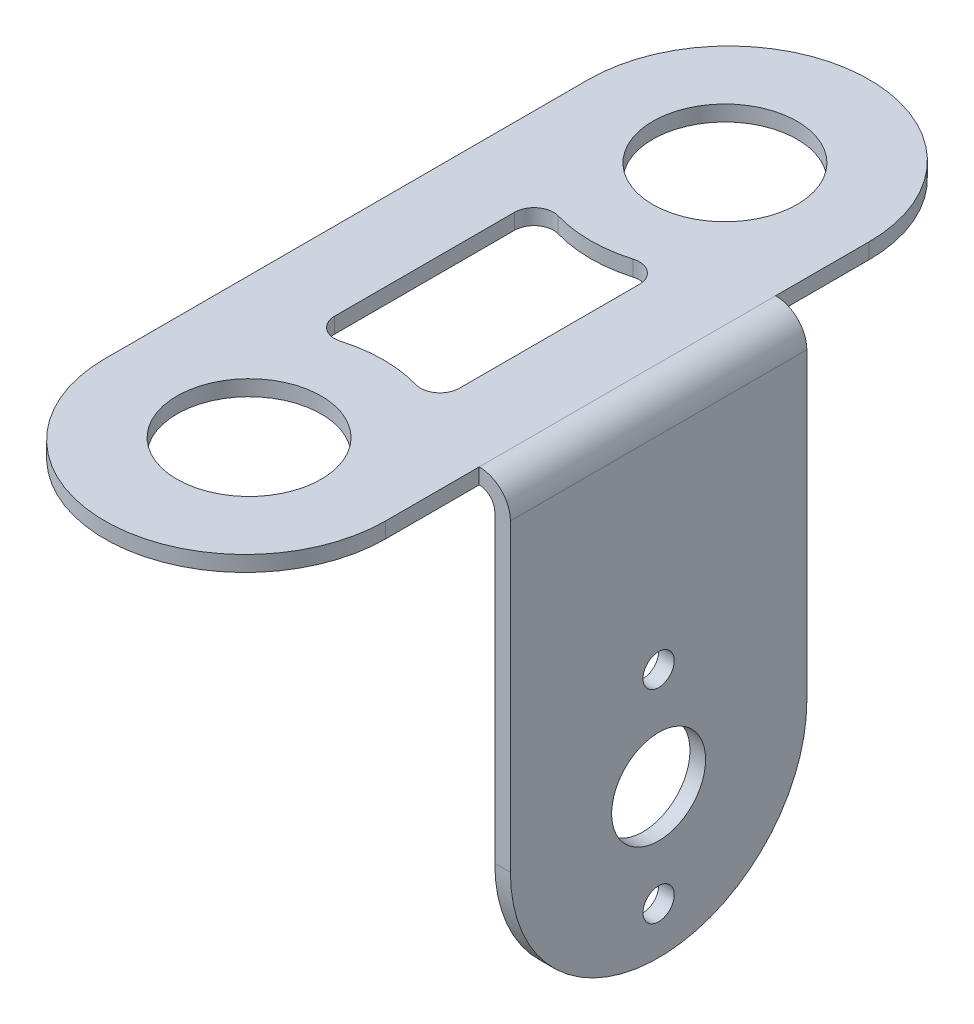
ISO-10303-21;
HEADER;
FILE_DESCRIPTION(('STEP AP214'),'2;1');
FILE_NAME('part.step','',(''),(''),'','','');
FILE_SCHEMA(('AUTOMOTIVE_DESIGN { 1 0 10303 214 1 1 1 1 }'));
ENDSEC;
DATA;
#1=APPLICATION_CONTEXT('core data for automotive mechanical design processes');
#2=APPLICATION_PROTOCOL_DEFINITION('international standard','automotive_design',2000,#1);
#3=PRODUCT_CONTEXT('',#1,'mechanical');
#4=PRODUCT('Part','Part','',(#3));
#5=PRODUCT_RELATED_PRODUCT_CATEGORY('part','',(#4));
#6=PRODUCT_DEFINITION_FORMATION('','',#4);
#7=PRODUCT_DEFINITION_CONTEXT('part definition',#1,'design');
#8=PRODUCT_DEFINITION('design','',#6,#7);
#9=PRODUCT_DEFINITION_SHAPE('','',#8);
#10=(LENGTH_UNIT() NAMED_UNIT(*) SI_UNIT(.MILLI.,.METRE.));
#11=(NAMED_UNIT(*) PLANE_ANGLE_UNIT() SI_UNIT($,.RADIAN.));
#12=(NAMED_UNIT(*) SI_UNIT($,.STERADIAN.) SOLID_ANGLE_UNIT());
#13=UNCERTAINTY_MEASURE_WITH_UNIT(LENGTH_MEASURE(1.E-05),#10,'distance_accuracy_value','');
#14=(GEOMETRIC_REPRESENTATION_CONTEXT(3) GLOBAL_UNCERTAINTY_ASSIGNED_CONTEXT((#13)) GLOBAL_UNIT_ASSIGNED_CONTEXT((#10,
#11,#12)) REPRESENTATION_CONTEXT('',''));
#15=CARTESIAN_POINT('',(0.,0.,0.));
#16=DIRECTION('',(0.,0.,1.));
#17=DIRECTION('',(1.,0.,0.));
#18=AXIS2_PLACEMENT_3D('',#15,#16,#17);
#19=CARTESIAN_POINT('',(-38.,60.,-31.));
#20=DIRECTION('',(-1.,0.,0.));
#21=DIRECTION('',(0.,0.,1.));
#22=AXIS2_PLACEMENT_3D('',#19,#20,#21);
#23=PLANE('',#22);
#24=DIRECTION('',(0.,0.,-1.));
#25=VECTOR('',#24,1.);
#26=CARTESIAN_POINT('',(-38.,62.,0.));
#27=LINE('',#26,#25);
#28=CARTESIAN_POINT('',(-38.,62.,31.));
#29=VERTEX_POINT('',#28);
#30=CARTESIAN_POINT('',(-38.,62.,-31.0000000036919));
#31=VERTEX_POINT('',#30);
#32=EDGE_CURVE('E187',#29,#31,#27,.T.);
#33=ORIENTED_EDGE('',*,*,#32,.T.);
#34=DIRECTION('',(0.,1.,0.));
#35=VECTOR('',#34,1.);
#36=CARTESIAN_POINT('',(-38.,61.,-31.0000000073837));
#37=LINE('',#36,#35);
#38=CARTESIAN_POINT('',(-38.,60.,-31.0000000036919));
#39=VERTEX_POINT('',#38);
#40=EDGE_CURVE('E211',#31,#39,#37,.F.);
#41=ORIENTED_EDGE('',*,*,#40,.T.);
#42=DIRECTION('',(0.,0.,-1.));
#43=VECTOR('',#42,1.);
#44=CARTESIAN_POINT('',(-38.,60.,0.));
#45=LINE('',#44,#43);
#46=CARTESIAN_POINT('',(-38.,60.,31.));
#47=VERTEX_POINT('',#46);
#48=EDGE_CURVE('E158',#47,#39,#45,.T.);
#49=ORIENTED_EDGE('',*,*,#48,.F.);
#50=DIRECTION('',(0.,-1.,0.));
#51=VECTOR('',#50,1.);
#52=CARTESIAN_POINT('',(-38.,61.,31.));
#53=LINE('',#52,#51);
#54=EDGE_CURVE('E155',#47,#29,#53,.F.);
#55=ORIENTED_EDGE('',*,*,#54,.T.);
#56=EDGE_LOOP('',(#33,#41,#49,#55));
#57=FACE_BOUND('',#56,.T.);
#58=ADVANCED_FACE('F16',(#57),#23,.T.);
#59=CARTESIAN_POINT('',(-25.5,60.,11.531275741));
#60=DIRECTION('',(0.,1.,0.));
#61=DIRECTION('',(0.,0.,1.));
#62=AXIS2_PLACEMENT_3D('',#59,#60,#61);
#63=CYLINDRICAL_SURFACE('',#62,2.5);
#64=CARTESIAN_POINT('',(-25.5,62.,11.531275741));
#65=DIRECTION('',(0.,1.,0.));
#66=DIRECTION('',(0.,0.,1.));
#67=AXIS2_PLACEMENT_3D('',#64,#65,#66);
#68=CIRCLE('',#67,2.5);
#69=CARTESIAN_POINT('',(-27.999999996,62.,11.531275741));
#70=VERTEX_POINT('',#69);
#71=CARTESIAN_POINT('',(-24.8037974650547,62.,13.9323800769473));
#72=VERTEX_POINT('',#71);
#73=EDGE_CURVE('E190',#70,#72,#68,.T.);
#74=ORIENTED_EDGE('',*,*,#73,.T.);
#75=DIRECTION('',(0.,1.,0.));
#76=VECTOR('',#75,1.);
#77=CARTESIAN_POINT('',(-24.8037974618409,61.,13.9323800760154));
#78=LINE('',#77,#76);
#79=CARTESIAN_POINT('',(-24.8037974651039,60.,13.9323800767773));
#80=VERTEX_POINT('',#79);
#81=EDGE_CURVE('E222',#72,#80,#78,.F.);
#82=ORIENTED_EDGE('',*,*,#81,.T.);
#83=CARTESIAN_POINT('',(-25.5,60.,11.531275741));
#84=DIRECTION('',(0.,1.,0.));
#85=DIRECTION('',(0.,0.,1.));
#86=AXIS2_PLACEMENT_3D('',#83,#84,#85);
#87=CIRCLE('',#86,2.5);
#88=CARTESIAN_POINT('',(-27.999999996,60.,11.531275741));
#89=VERTEX_POINT('',#88);
#90=EDGE_CURVE('E199',#89,#80,#87,.T.);
#91=ORIENTED_EDGE('',*,*,#90,.F.);
#92=DIRECTION('',(0.,1.,0.));
#93=VECTOR('',#92,1.);
#94=CARTESIAN_POINT('',(-28.,61.,11.531275741));
#95=LINE('',#94,#93);
#96=EDGE_CURVE('E207',#89,#70,#95,.T.);
#97=ORIENTED_EDGE('',*,*,#96,.T.);
#98=EDGE_LOOP('',(#74,#82,#91,#97));
#99=FACE_BOUND('',#98,.T.);
#100=ADVANCED_FACE('F413',(#99),#63,.F.);
#101=CARTESIAN_POINT('',(-20.,60.,30.5));
#102=DIRECTION('',(0.,1.,0.));
#103=DIRECTION('',(0.,0.,1.));
#104=AXIS2_PLACEMENT_3D('',#101,#102,#103);
#105=CYLINDRICAL_SURFACE('',#104,17.25);
#106=DIRECTION('',(0.,-1.,0.));
#107=VECTOR('',#106,1.);
#108=CARTESIAN_POINT('',(-15.1962025311328,61.,13.9323800776843));
#109=LINE('',#108,#107);
#110=CARTESIAN_POINT('',(-15.1962025314322,60.,13.9323800777817));
#111=VERTEX_POINT('',#110);
#112=CARTESIAN_POINT('',(-15.1962025313829,62.,13.9323800776118));
#113=VERTEX_POINT('',#112);
#114=EDGE_CURVE('E220',#111,#113,#109,.F.);
#115=ORIENTED_EDGE('',*,*,#114,.F.);
#116=CARTESIAN_POINT('',(-20.,60.,30.5));
#117=DIRECTION('',(0.,1.,0.));
#118=DIRECTION('',(0.,0.,1.));
#119=AXIS2_PLACEMENT_3D('',#116,#117,#118);
#120=CIRCLE('',#119,17.25);
#121=EDGE_CURVE('E298',#80,#111,#120,.F.);
#122=ORIENTED_EDGE('',*,*,#121,.F.);
#123=ORIENTED_EDGE('',*,*,#81,.F.);
#124=CARTESIAN_POINT('',(-20.,62.,30.5));
#125=DIRECTION('',(0.,1.,0.));
#126=DIRECTION('',(0.,0.,1.));
#127=AXIS2_PLACEMENT_3D('',#124,#125,#126);
#128=CIRCLE('',#127,17.25);
#129=EDGE_CURVE('E280',#72,#113,#128,.F.);
#130=ORIENTED_EDGE('',*,*,#129,.T.);
#131=EDGE_LOOP('',(#115,#122,#123,#130));
#132=FACE_BOUND('',#131,.T.);
#133=ADVANCED_FACE('F417',(#132),#105,.T.);
#134=CARTESIAN_POINT('',(-14.5,60.,11.531275741));
#135=DIRECTION('',(0.,1.,0.));
#136=DIRECTION('',(0.,0.,1.));
#137=AXIS2_PLACEMENT_3D('',#134,#135,#136);
#138=CYLINDRICAL_SURFACE('',#137,2.5);
#139=CARTESIAN_POINT('',(-14.5,62.,11.531275741));
#140=DIRECTION('',(0.,1.,0.));
#141=DIRECTION('',(0.,0.,1.));
#142=AXIS2_PLACEMENT_3D('',#139,#140,#141);
#143=CIRCLE('',#142,2.5);
#144=CARTESIAN_POINT('',(-12.000000004,62.,11.531275741));
#145=VERTEX_POINT('',#144);
#146=EDGE_CURVE('E186',#113,#145,#143,.T.);
#147=ORIENTED_EDGE('',*,*,#146,.T.);
#148=DIRECTION('',(0.,-1.,0.));
#149=VECTOR('',#148,1.);
#150=CARTESIAN_POINT('',(-12.,61.,11.531275741));
#151=LINE('',#150,#149);
#152=CARTESIAN_POINT('',(-12.000000004,60.,11.531275741));
#153=VERTEX_POINT('',#152);
#154=EDGE_CURVE('E217',#145,#153,#151,.T.);
#155=ORIENTED_EDGE('',*,*,#154,.T.);
#156=CARTESIAN_POINT('',(-14.5,60.,11.531275741));
#157=DIRECTION('',(0.,1.,0.));
#158=DIRECTION('',(0.,0.,1.));
#159=AXIS2_PLACEMENT_3D('',#156,#157,#158);
#160=CIRCLE('',#159,2.5);
#161=EDGE_CURVE('E195',#111,#153,#160,.T.);
#162=ORIENTED_EDGE('',*,*,#161,.F.);
#163=ORIENTED_EDGE('',*,*,#114,.T.);
#164=EDGE_LOOP('',(#147,#155,#162,#163));
#165=FACE_BOUND('',#164,.T.);
#166=ADVANCED_FACE('F409',(#165),#138,.F.);
#167=CARTESIAN_POINT('',(-12.,60.,-11.531275741));
#168=DIRECTION('',(1.,0.,0.));
#169=DIRECTION('',(0.,1.,0.));
#170=AXIS2_PLACEMENT_3D('',#167,#168,#169);
#171=PLANE('',#170);
#172=DIRECTION('',(0.,-1.,0.));
#173=VECTOR('',#172,1.);
#174=CARTESIAN_POINT('',(-12.,61.,-11.5312757420255));
#175=LINE('',#174,#173);
#176=CARTESIAN_POINT('',(-12.000000004,60.,-11.5312757415128));
#177=VERTEX_POINT('',#176);
#178=CARTESIAN_POINT('',(-12.000000004,62.,-11.5312757415128));
#179=VERTEX_POINT('',#178);
#180=EDGE_CURVE('E215',#177,#179,#175,.F.);
#181=ORIENTED_EDGE('',*,*,#180,.F.);
#182=DIRECTION('',(0.,0.,-1.));
#183=VECTOR('',#182,1.);
#184=CARTESIAN_POINT('',(-12.000000008,60.,0.));
#185=LINE('',#184,#183);
#186=EDGE_CURVE('E192',#153,#177,#185,.T.);
#187=ORIENTED_EDGE('',*,*,#186,.F.);
#188=ORIENTED_EDGE('',*,*,#154,.F.);
#189=DIRECTION('',(0.,0.,-1.));
#190=VECTOR('',#189,1.);
#191=CARTESIAN_POINT('',(-12.000000008,62.,0.));
#192=LINE('',#191,#190);
#193=EDGE_CURVE('E182',#145,#179,#192,.T.);
#194=ORIENTED_EDGE('',*,*,#193,.T.);
#195=EDGE_LOOP('',(#181,#187,#188,#194));
#196=FACE_BOUND('',#195,.T.);
#197=ADVANCED_FACE('F405',(#196),#171,.F.);
#198=CARTESIAN_POINT('',(-14.5,60.,-11.531275741));
#199=DIRECTION('',(0.,1.,0.));
#200=DIRECTION('',(0.,0.,1.));
#201=AXIS2_PLACEMENT_3D('',#198,#199,#200);
#202=CYLINDRICAL_SURFACE('',#201,2.5);
#203=CARTESIAN_POINT('',(-14.5,62.,-11.531275741));
#204=DIRECTION('',(0.,1.,0.));
#205=DIRECTION('',(0.,0.,1.));
#206=AXIS2_PLACEMENT_3D('',#203,#204,#205);
#207=CIRCLE('',#206,2.5);
#208=CARTESIAN_POINT('',(-15.1962025300596,62.,-13.9323800783639));
#209=VERTEX_POINT('',#208);
#210=EDGE_CURVE('E185',#179,#209,#207,.T.);
#211=ORIENTED_EDGE('',*,*,#210,.T.);
#212=DIRECTION('',(0.,1.,0.));
#213=VECTOR('',#212,1.);
#214=CARTESIAN_POINT('',(-15.1962025283876,61.,-13.9323800788487));
#215=LINE('',#214,#213);
#216=CARTESIAN_POINT('',(-15.1962025300103,60.,-13.932380078194));
#217=VERTEX_POINT('',#216);
#218=EDGE_CURVE('E213',#209,#217,#215,.F.);
#219=ORIENTED_EDGE('',*,*,#218,.T.);
#220=CARTESIAN_POINT('',(-14.5,60.,-11.531275741));
#221=DIRECTION('',(0.,1.,0.));
#222=DIRECTION('',(0.,0.,1.));
#223=AXIS2_PLACEMENT_3D('',#220,#221,#222);
#224=CIRCLE('',#223,2.5);
#225=EDGE_CURVE('E194',#177,#217,#224,.T.);
#226=ORIENTED_EDGE('',*,*,#225,.F.);
#227=ORIENTED_EDGE('',*,*,#180,.T.);
#228=EDGE_LOOP('',(#211,#219,#226,#227));
#229=FACE_BOUND('',#228,.T.);
#230=ADVANCED_FACE('F408',(#229),#202,.F.);
#231=CARTESIAN_POINT('',(-20.,60.,-30.5));
#232=DIRECTION('',(0.,1.,0.));
#233=DIRECTION('',(0.,0.,1.));
#234=AXIS2_PLACEMENT_3D('',#231,#232,#233);
#235=CYLINDRICAL_SURFACE('',#234,17.25);
#236=ORIENTED_EDGE('',*,*,#218,.F.);
#237=CARTESIAN_POINT('',(-20.,62.,-30.5));
#238=DIRECTION('',(0.,1.,0.));
#239=DIRECTION('',(0.,0.,1.));
#240=AXIS2_PLACEMENT_3D('',#237,#238,#239);
#241=CIRCLE('',#240,17.25);
#242=CARTESIAN_POINT('',(-24.803797467909,62.,-13.9323800774065));
#243=VERTEX_POINT('',#242);
#244=EDGE_CURVE('E273',#209,#243,#241,.F.);
#245=ORIENTED_EDGE('',*,*,#244,.T.);
#246=DIRECTION('',(0.,-1.,0.));
#247=VECTOR('',#246,1.);
#248=CARTESIAN_POINT('',(-24.8037974674511,61.,-13.9323800772737));
#249=LINE('',#248,#247);
#250=CARTESIAN_POINT('',(-24.8037974678597,60.,-13.9323800775764));
#251=VERTEX_POINT('',#250);
#252=EDGE_CURVE('E208',#251,#243,#249,.F.);
#253=ORIENTED_EDGE('',*,*,#252,.F.);
#254=CARTESIAN_POINT('',(-20.,60.,-30.5));
#255=DIRECTION('',(0.,1.,0.));
#256=DIRECTION('',(0.,0.,1.));
#257=AXIS2_PLACEMENT_3D('',#254,#255,#256);
#258=CIRCLE('',#257,17.25);
#259=EDGE_CURVE('E302',#217,#251,#258,.F.);
#260=ORIENTED_EDGE('',*,*,#259,.F.);
#261=EDGE_LOOP('',(#236,#245,#253,#260));
#262=FACE_BOUND('',#261,.T.);
#263=ADVANCED_FACE('F427',(#262),#235,.T.);
#264=CARTESIAN_POINT('',(-25.5,60.,-11.531275741));
#265=DIRECTION('',(0.,1.,0.));
#266=DIRECTION('',(0.,0.,1.));
#267=AXIS2_PLACEMENT_3D('',#264,#265,#266);
#268=CYLINDRICAL_SURFACE('',#267,2.5);
#269=CARTESIAN_POINT('',(-25.5,62.,-11.531275741));
#270=DIRECTION('',(0.,1.,0.));
#271=DIRECTION('',(0.,0.,1.));
#272=AXIS2_PLACEMENT_3D('',#269,#270,#271);
#273=CIRCLE('',#272,2.5);
#274=CARTESIAN_POINT('',(-27.999999996,62.,-11.531275741));
#275=VERTEX_POINT('',#274);
#276=EDGE_CURVE('E181',#243,#275,#273,.T.);
#277=ORIENTED_EDGE('',*,*,#276,.T.);
#278=DIRECTION('',(0.,-1.,0.));
#279=VECTOR('',#278,1.);
#280=CARTESIAN_POINT('',(-28.,61.,-11.531275741));
#281=LINE('',#280,#279);
#282=CARTESIAN_POINT('',(-27.999999996,60.,-11.531275741));
#283=VERTEX_POINT('',#282);
#284=EDGE_CURVE('E204',#275,#283,#281,.T.);
#285=ORIENTED_EDGE('',*,*,#284,.T.);
#286=CARTESIAN_POINT('',(-25.5,60.,-11.531275741));
#287=DIRECTION('',(0.,1.,0.));
#288=DIRECTION('',(0.,0.,1.));
#289=AXIS2_PLACEMENT_3D('',#286,#287,#288);
#290=CIRCLE('',#289,2.5);
#291=EDGE_CURVE('E200',#251,#283,#290,.T.);
#292=ORIENTED_EDGE('',*,*,#291,.F.);
#293=ORIENTED_EDGE('',*,*,#252,.T.);
#294=EDGE_LOOP('',(#277,#285,#292,#293));
#295=FACE_BOUND('',#294,.T.);
#296=ADVANCED_FACE('F403',(#295),#268,.F.);
#297=CARTESIAN_POINT('',(-28.,62.,-11.531275741));
#298=DIRECTION('',(-1.,0.,0.));
#299=DIRECTION('',(0.,-1.,0.));
#300=AXIS2_PLACEMENT_3D('',#297,#298,#299);
#301=PLANE('',#300);
#302=ORIENTED_EDGE('',*,*,#96,.F.);
#303=DIRECTION('',(0.,0.,1.));
#304=VECTOR('',#303,1.);
#305=CARTESIAN_POINT('',(-27.999999992,60.,0.));
#306=LINE('',#305,#304);
#307=EDGE_CURVE('E196',#283,#89,#306,.T.);
#308=ORIENTED_EDGE('',*,*,#307,.F.);
#309=ORIENTED_EDGE('',*,*,#284,.F.);
#310=DIRECTION('',(0.,0.,1.));
#311=VECTOR('',#310,1.);
#312=CARTESIAN_POINT('',(-27.999999992,62.,0.));
#313=LINE('',#312,#311);
#314=EDGE_CURVE('E177',#275,#70,#313,.T.);
#315=ORIENTED_EDGE('',*,*,#314,.T.);
#316=EDGE_LOOP('',(#302,#308,#309,#315));
#317=FACE_BOUND('',#316,.T.);
#318=ADVANCED_FACE('F399',(#317),#301,.F.);
#319=CARTESIAN_POINT('',(-20.,60.,30.5));
#320=DIRECTION('',(0.,1.,0.));
#321=DIRECTION('',(0.,0.,1.));
#322=AXIS2_PLACEMENT_3D('',#319,#320,#321);
#323=CYLINDRICAL_SURFACE('',#322,9.25);
#324=CARTESIAN_POINT('',(-20.,60.,30.5));
#325=DIRECTION('',(0.,1.,0.));
#326=DIRECTION('',(0.,0.,1.));
#327=AXIS2_PLACEMENT_3D('',#324,#325,#326);
#328=CIRCLE('',#327,9.25);
#329=CARTESIAN_POINT('',(-20.,60.,39.75));
#330=VERTEX_POINT('',#329);
#331=EDGE_CURVE('E292',#330,#330,#328,.T.);
#332=ORIENTED_EDGE('',*,*,#331,.F.);
#333=EDGE_LOOP('',(#332));
#334=FACE_BOUND('',#333,.T.);
#335=CARTESIAN_POINT('',(-20.,62.,30.5));
#336=DIRECTION('',(0.,1.,0.));
#337=DIRECTION('',(0.,0.,1.));
#338=AXIS2_PLACEMENT_3D('',#335,#336,#337);
#339=CIRCLE('',#338,9.25);
#340=CARTESIAN_POINT('',(-20.,62.,39.75));
#341=VERTEX_POINT('',#340);
#342=EDGE_CURVE('E180',#341,#341,#339,.T.);
#343=ORIENTED_EDGE('',*,*,#342,.T.);
#344=EDGE_LOOP('',(#343));
#345=FACE_BOUND('',#344,.T.);
#346=ADVANCED_FACE('F402',(#334,#345),#323,.F.);
#347=CARTESIAN_POINT('',(-20.,60.,-30.5));
#348=DIRECTION('',(0.,1.,0.));
#349=DIRECTION('',(0.,0.,1.));
#350=AXIS2_PLACEMENT_3D('',#347,#348,#349);
#351=CYLINDRICAL_SURFACE('',#350,9.25);
#352=CARTESIAN_POINT('',(-20.,60.,-30.5));
#353=DIRECTION('',(0.,1.,0.));
#354=DIRECTION('',(0.,0.,1.));
#355=AXIS2_PLACEMENT_3D('',#352,#353,#354);
#356=CIRCLE('',#355,9.25);
#357=CARTESIAN_POINT('',(-20.,60.,-21.25));
#358=VERTEX_POINT('',#357);
#359=EDGE_CURVE('E289',#358,#358,#356,.T.);
#360=ORIENTED_EDGE('',*,*,#359,.F.);
#361=EDGE_LOOP('',(#360));
#362=FACE_BOUND('',#361,.T.);
#363=CARTESIAN_POINT('',(-20.,62.,-30.5));
#364=DIRECTION('',(0.,1.,0.));
#365=DIRECTION('',(0.,0.,1.));
#366=AXIS2_PLACEMENT_3D('',#363,#364,#365);
#367=CIRCLE('',#366,9.25);
#368=CARTESIAN_POINT('',(-20.,62.,-21.25));
#369=VERTEX_POINT('',#368);
#370=EDGE_CURVE('E176',#369,#369,#367,.T.);
#371=ORIENTED_EDGE('',*,*,#370,.T.);
#372=EDGE_LOOP('',(#371));
#373=FACE_BOUND('',#372,.T.);
#374=ADVANCED_FACE('F437',(#362,#373),#351,.F.);
#375=CARTESIAN_POINT('',(-20.,62.,-31.));
#376=DIRECTION('',(0.,-1.,0.));
#377=DIRECTION('',(0.,0.,-1.));
#378=AXIS2_PLACEMENT_3D('',#375,#376,#377);
#379=CYLINDRICAL_SURFACE('',#378,18.);
#380=CARTESIAN_POINT('',(-20.,60.,-31.));
#381=DIRECTION('',(0.,-1.,0.));
#382=DIRECTION('',(0.,0.,-1.));
#383=AXIS2_PLACEMENT_3D('',#380,#381,#382);
#384=CIRCLE('',#383,18.);
#385=CARTESIAN_POINT('',(-2.,60.,-31.));
#386=VERTEX_POINT('',#385);
#387=EDGE_CURVE('E201',#39,#386,#384,.T.);
#388=ORIENTED_EDGE('',*,*,#387,.F.);
#389=ORIENTED_EDGE('',*,*,#40,.F.);
#390=CARTESIAN_POINT('',(-20.,62.,-31.));
#391=DIRECTION('',(0.,-1.,0.));
#392=DIRECTION('',(0.,0.,-1.));
#393=AXIS2_PLACEMENT_3D('',#390,#391,#392);
#394=CIRCLE('',#393,18.);
#395=CARTESIAN_POINT('',(-2.,62.,-31.));
#396=VERTEX_POINT('',#395);
#397=EDGE_CURVE('E286',#31,#396,#394,.T.);
#398=ORIENTED_EDGE('',*,*,#397,.T.);
#399=DIRECTION('',(0.,1.,0.));
#400=VECTOR('',#399,1.);
#401=CARTESIAN_POINT('',(-2.,61.,-31.));
#402=LINE('',#401,#400);
#403=EDGE_CURVE('E172',#386,#396,#402,.T.);
#404=ORIENTED_EDGE('',*,*,#403,.F.);
#405=EDGE_LOOP('',(#388,#389,#398,#404));
#406=FACE_BOUND('',#405,.T.);
#407=ADVANCED_FACE('F311',(#406),#379,.T.);
#408=CARTESIAN_POINT('',(-20.,60.,31.));
#409=DIRECTION('',(0.,1.,0.));
#410=DIRECTION('',(0.,0.,1.));
#411=AXIS2_PLACEMENT_3D('',#408,#409,#410);
#412=CYLINDRICAL_SURFACE('',#411,18.);
#413=CARTESIAN_POINT('',(-20.,62.,31.));
#414=DIRECTION('',(0.,1.,0.));
#415=DIRECTION('',(0.,0.,1.));
#416=AXIS2_PLACEMENT_3D('',#413,#414,#415);
#417=CIRCLE('',#416,18.);
#418=CARTESIAN_POINT('',(-2.,62.,31.));
#419=VERTEX_POINT('',#418);
#420=EDGE_CURVE('E191',#419,#29,#417,.F.);
#421=ORIENTED_EDGE('',*,*,#420,.T.);
#422=ORIENTED_EDGE('',*,*,#54,.F.);
#423=CARTESIAN_POINT('',(-20.,60.,31.));
#424=DIRECTION('',(0.,1.,0.));
#425=DIRECTION('',(0.,0.,1.));
#426=AXIS2_PLACEMENT_3D('',#423,#424,#425);
#427=CIRCLE('',#426,18.);
#428=CARTESIAN_POINT('',(-2.,60.,31.));
#429=VERTEX_POINT('',#428);
#430=EDGE_CURVE('E20',#429,#47,#427,.F.);
#431=ORIENTED_EDGE('',*,*,#430,.F.);
#432=DIRECTION('',(0.,-1.,0.));
#433=VECTOR('',#432,1.);
#434=CARTESIAN_POINT('',(-2.,61.,31.));
#435=LINE('',#434,#433);
#436=EDGE_CURVE('E140',#419,#429,#435,.T.);
#437=ORIENTED_EDGE('',*,*,#436,.F.);
#438=EDGE_LOOP('',(#421,#422,#431,#437));
#439=FACE_BOUND('',#438,.T.);
#440=ADVANCED_FACE('F154',(#439),#412,.T.);
#441=CARTESIAN_POINT('',(-38.,60.,-49.588));
#442=DIRECTION('',(0.,-1.,0.));
#443=DIRECTION('',(1.,0.,0.));
#444=AXIS2_PLACEMENT_3D('',#441,#442,#443);
#445=PLANE('',#444);
#446=ORIENTED_EDGE('',*,*,#359,.T.);
#447=EDGE_LOOP('',(#446));
#448=FACE_BOUND('',#447,.T.);
#449=ORIENTED_EDGE('',*,*,#331,.T.);
#450=EDGE_LOOP('',(#449));
#451=FACE_BOUND('',#450,.T.);
#452=ORIENTED_EDGE('',*,*,#186,.T.);
#453=ORIENTED_EDGE('',*,*,#225,.T.);
#454=ORIENTED_EDGE('',*,*,#259,.T.);
#455=ORIENTED_EDGE('',*,*,#291,.T.);
#456=ORIENTED_EDGE('',*,*,#307,.T.);
#457=ORIENTED_EDGE('',*,*,#90,.T.);
#458=ORIENTED_EDGE('',*,*,#121,.T.);
#459=ORIENTED_EDGE('',*,*,#161,.T.);
#460=EDGE_LOOP('',(#452,#453,#454,#455,#456,#457,#458,#459));
#461=FACE_BOUND('',#460,.T.);
#462=DIRECTION('',(0.,0.,-1.));
#463=VECTOR('',#462,1.);
#464=CARTESIAN_POINT('',(-2.,60.,-25.));
#465=LINE('',#464,#463);
#466=CARTESIAN_POINT('',(-1.9999999997949,60.,-19.));
#467=VERTEX_POINT('',#466);
#468=EDGE_CURVE('E173',#467,#386,#465,.T.);
#469=ORIENTED_EDGE('',*,*,#468,.F.);
#470=DIRECTION('',(0.,0.,1.));
#471=VECTOR('',#470,1.);
#472=CARTESIAN_POINT('',(-1.9999999995898,60.,0.));
#473=LINE('',#472,#471);
#474=CARTESIAN_POINT('',(-1.9999999997949,60.,19.));
#475=VERTEX_POINT('',#474);
#476=EDGE_CURVE('E161',#475,#467,#473,.F.);
#477=ORIENTED_EDGE('',*,*,#476,.F.);
#478=DIRECTION('',(0.,0.,-1.));
#479=VECTOR('',#478,1.);
#480=CARTESIAN_POINT('',(-2.,60.,25.));
#481=LINE('',#480,#479);
#482=EDGE_CURVE('E145',#429,#475,#481,.T.);
#483=ORIENTED_EDGE('',*,*,#482,.F.);
#484=ORIENTED_EDGE('',*,*,#430,.T.);
#485=ORIENTED_EDGE('',*,*,#48,.T.);
#486=ORIENTED_EDGE('',*,*,#387,.T.);
#487=EDGE_LOOP('',(#469,#477,#483,#484,#485,#486));
#488=FACE_BOUND('',#487,.T.);
#489=ADVANCED_FACE('F160',(#448,#451,#461,#488),#445,.T.);
#490=CARTESIAN_POINT('',(-38.,62.,-49.588));
#491=DIRECTION('',(0.,-1.,0.));
#492=DIRECTION('',(1.,0.,0.));
#493=AXIS2_PLACEMENT_3D('',#490,#491,#492);
#494=PLANE('',#493);
#495=ORIENTED_EDGE('',*,*,#370,.F.);
#496=EDGE_LOOP('',(#495));
#497=FACE_BOUND('',#496,.T.);
#498=ORIENTED_EDGE('',*,*,#342,.F.);
#499=EDGE_LOOP('',(#498));
#500=FACE_BOUND('',#499,.T.);
#501=ORIENTED_EDGE('',*,*,#276,.F.);
#502=ORIENTED_EDGE('',*,*,#244,.F.);
#503=ORIENTED_EDGE('',*,*,#210,.F.);
#504=ORIENTED_EDGE('',*,*,#193,.F.);
#505=ORIENTED_EDGE('',*,*,#146,.F.);
#506=ORIENTED_EDGE('',*,*,#129,.F.);
#507=ORIENTED_EDGE('',*,*,#73,.F.);
#508=ORIENTED_EDGE('',*,*,#314,.F.);
#509=EDGE_LOOP('',(#501,#502,#503,#504,#505,#506,#507,#508));
#510=FACE_BOUND('',#509,.T.);
#511=ORIENTED_EDGE('',*,*,#420,.F.);
#512=DIRECTION('',(0.,0.,1.));
#513=VECTOR('',#512,1.);
#514=CARTESIAN_POINT('',(-2.,62.,25.));
#515=LINE('',#514,#513);
#516=CARTESIAN_POINT('',(-1.99999999958979,62.,19.));
#517=VERTEX_POINT('',#516);
#518=EDGE_CURVE('E148',#517,#419,#515,.T.);
#519=ORIENTED_EDGE('',*,*,#518,.F.);
#520=DIRECTION('',(0.,0.,1.));
#521=VECTOR('',#520,1.);
#522=CARTESIAN_POINT('',(-1.99999999917959,62.,0.));
#523=LINE('',#522,#521);
#524=CARTESIAN_POINT('',(-1.99999999958979,62.,-19.));
#525=VERTEX_POINT('',#524);
#526=EDGE_CURVE('E164',#517,#525,#523,.F.);
#527=ORIENTED_EDGE('',*,*,#526,.T.);
#528=DIRECTION('',(0.,0.,1.));
#529=VECTOR('',#528,1.);
#530=CARTESIAN_POINT('',(-2.,62.,-25.));
#531=LINE('',#530,#529);
#532=EDGE_CURVE('E169',#396,#525,#531,.T.);
#533=ORIENTED_EDGE('',*,*,#532,.F.);
#534=ORIENTED_EDGE('',*,*,#397,.F.);
#535=ORIENTED_EDGE('',*,*,#32,.F.);
#536=EDGE_LOOP('',(#511,#519,#527,#533,#534,#535));
#537=FACE_BOUND('',#536,.T.);
#538=ADVANCED_FACE('F317',(#497,#500,#510,#537),#494,.F.);
#539=CARTESIAN_POINT('',(-2.,60.,-19.));
#540=DIRECTION('',(1.,0.,0.));
#541=DIRECTION('',(0.,0.,-1.));
#542=AXIS2_PLACEMENT_3D('',#539,#540,#541);
#543=PLANE('',#542);
#544=ORIENTED_EDGE('',*,*,#532,.T.);
#545=DIRECTION('',(0.,-1.,0.));
#546=VECTOR('',#545,1.);
#547=CARTESIAN_POINT('',(-2.,40.629,-19.));
#548=LINE('',#547,#546);
#549=EDGE_CURVE('E263',#525,#467,#548,.T.);
#550=ORIENTED_EDGE('',*,*,#549,.T.);
#551=ORIENTED_EDGE('',*,*,#468,.T.);
#552=ORIENTED_EDGE('',*,*,#403,.T.);
#553=EDGE_LOOP('',(#544,#550,#551,#552));
#554=FACE_BOUND('',#553,.T.);
#555=ADVANCED_FACE('F309',(#554),#543,.T.);
#556=CARTESIAN_POINT('',(-2.,62.,19.));
#557=DIRECTION('',(1.,0.,0.));
#558=DIRECTION('',(0.,0.,1.));
#559=AXIS2_PLACEMENT_3D('',#556,#557,#558);
#560=PLANE('',#559);
#561=ORIENTED_EDGE('',*,*,#482,.T.);
#562=DIRECTION('',(0.,1.,0.));
#563=VECTOR('',#562,1.);
#564=CARTESIAN_POINT('',(-2.,40.629,19.));
#565=LINE('',#564,#563);
#566=EDGE_CURVE('E256',#475,#517,#565,.T.);
#567=ORIENTED_EDGE('',*,*,#566,.T.);
#568=ORIENTED_EDGE('',*,*,#518,.T.);
#569=ORIENTED_EDGE('',*,*,#436,.T.);
#570=EDGE_LOOP('',(#561,#567,#568,#569));
#571=FACE_BOUND('',#570,.T.);
#572=ADVANCED_FACE('F142',(#571),#560,.T.);
#573=CARTESIAN_POINT('',(-2.,58.,19.));
#574=DIRECTION('',(0.,0.,-1.));
#575=DIRECTION('',(-1.,0.,0.));
#576=AXIS2_PLACEMENT_3D('',#573,#574,#575);
#577=CYLINDRICAL_SURFACE('',#576,2.);
#578=CARTESIAN_POINT('',(-2.,58.,-19.));
#579=DIRECTION('',(0.,0.,-1.));
#580=DIRECTION('',(-1.,0.,0.));
#581=AXIS2_PLACEMENT_3D('',#578,#579,#580);
#582=CIRCLE('',#581,2.);
#583=CARTESIAN_POINT('',(0.,58.,-19.));
#584=VERTEX_POINT('',#583);
#585=EDGE_CURVE('E261',#467,#584,#582,.T.);
#586=ORIENTED_EDGE('',*,*,#585,.T.);
#587=DIRECTION('',(0.,0.,-1.));
#588=VECTOR('',#587,1.);
#589=CARTESIAN_POINT('',(0.,58.,0.));
#590=LINE('',#589,#588);
#591=CARTESIAN_POINT('',(0.,58.,19.));
#592=VERTEX_POINT('',#591);
#593=EDGE_CURVE('E248',#592,#584,#590,.T.);
#594=ORIENTED_EDGE('',*,*,#593,.F.);
#595=CARTESIAN_POINT('',(-2.,58.,19.));
#596=DIRECTION('',(0.,0.,-1.));
#597=DIRECTION('',(-1.,0.,0.));
#598=AXIS2_PLACEMENT_3D('',#595,#596,#597);
#599=CIRCLE('',#598,2.);
#600=EDGE_CURVE('E257',#592,#475,#599,.F.);
#601=ORIENTED_EDGE('',*,*,#600,.T.);
#602=ORIENTED_EDGE('',*,*,#476,.T.);
#603=EDGE_LOOP('',(#586,#594,#601,#602));
#604=FACE_BOUND('',#603,.T.);
#605=ADVANCED_FACE('F344',(#604),#577,.F.);
#606=CARTESIAN_POINT('',(-2.,58.,19.));
#607=DIRECTION('',(0.,0.,-1.));
#608=DIRECTION('',(-1.,0.,0.));
#609=AXIS2_PLACEMENT_3D('',#606,#607,#608);
#610=CYLINDRICAL_SURFACE('',#609,4.);
#611=CARTESIAN_POINT('',(-2.,58.,19.));
#612=DIRECTION('',(0.,0.,-1.));
#613=DIRECTION('',(-1.,0.,0.));
#614=AXIS2_PLACEMENT_3D('',#611,#612,#613);
#615=CIRCLE('',#614,4.);
#616=CARTESIAN_POINT('',(2.,58.,19.));
#617=VERTEX_POINT('',#616);
#618=EDGE_CURVE('E253',#517,#617,#615,.T.);
#619=ORIENTED_EDGE('',*,*,#618,.T.);
#620=DIRECTION('',(0.,0.,-1.));
#621=VECTOR('',#620,1.);
#622=CARTESIAN_POINT('',(2.,58.,0.));
#623=LINE('',#622,#621);
#624=CARTESIAN_POINT('',(2.,58.,-19.));
#625=VERTEX_POINT('',#624);
#626=EDGE_CURVE('E244',#617,#625,#623,.T.);
#627=ORIENTED_EDGE('',*,*,#626,.T.);
#628=CARTESIAN_POINT('',(-2.,58.,-19.));
#629=DIRECTION('',(0.,0.,-1.));
#630=DIRECTION('',(-1.,0.,0.));
#631=AXIS2_PLACEMENT_3D('',#628,#629,#630);
#632=CIRCLE('',#631,4.);
#633=EDGE_CURVE('E264',#625,#525,#632,.F.);
#634=ORIENTED_EDGE('',*,*,#633,.T.);
#635=ORIENTED_EDGE('',*,*,#526,.F.);
#636=EDGE_LOOP('',(#619,#627,#634,#635));
#637=FACE_BOUND('',#636,.T.);
#638=ADVANCED_FACE('F328',(#637),#610,.T.);
#639=CARTESIAN_POINT('',(-2.,62.258,-19.));
#640=DIRECTION('',(0.,0.,1.));
#641=DIRECTION('',(0.,-1.,0.));
#642=AXIS2_PLACEMENT_3D('',#639,#640,#641);
#643=PLANE('',#642);
#644=DIRECTION('',(1.,0.,0.));
#645=VECTOR('',#644,1.);
#646=CARTESIAN_POINT('',(1.,18.9999999965878,-19.));
#647=LINE('',#646,#645);
#648=CARTESIAN_POINT('',(2.,18.9999999982939,-19.));
#649=VERTEX_POINT('',#648);
#650=CARTESIAN_POINT('',(0.,18.9999999982939,-19.));
#651=VERTEX_POINT('',#650);
#652=EDGE_CURVE('E260',#649,#651,#647,.F.);
#653=ORIENTED_EDGE('',*,*,#652,.T.);
#654=DIRECTION('',(0.,-1.,0.));
#655=VECTOR('',#654,1.);
#656=CARTESIAN_POINT('',(0.,28.826,-19.));
#657=LINE('',#656,#655);
#658=EDGE_CURVE('E252',#584,#651,#657,.T.);
#659=ORIENTED_EDGE('',*,*,#658,.F.);
#660=ORIENTED_EDGE('',*,*,#585,.F.);
#661=ORIENTED_EDGE('',*,*,#549,.F.);
#662=ORIENTED_EDGE('',*,*,#633,.F.);
#663=DIRECTION('',(0.,-1.,0.));
#664=VECTOR('',#663,1.);
#665=CARTESIAN_POINT('',(2.,28.826,-19.));
#666=LINE('',#665,#664);
#667=EDGE_CURVE('E240',#625,#649,#666,.T.);
#668=ORIENTED_EDGE('',*,*,#667,.T.);
#669=EDGE_LOOP('',(#653,#659,#660,#661,#662,#668));
#670=FACE_BOUND('',#669,.T.);
#671=ADVANCED_FACE('F322',(#670),#643,.F.);
#672=CARTESIAN_POINT('',(0.,19.,0.));
#673=DIRECTION('',(1.,0.,0.));
#674=DIRECTION('',(0.,0.,-1.));
#675=AXIS2_PLACEMENT_3D('',#672,#673,#674);
#676=CYLINDRICAL_SURFACE('',#675,19.);
#677=CARTESIAN_POINT('',(2.,19.,0.));
#678=DIRECTION('',(1.,0.,0.));
#679=DIRECTION('',(0.,0.,-1.));
#680=AXIS2_PLACEMENT_3D('',#677,#678,#679);
#681=CIRCLE('',#680,19.);
#682=CARTESIAN_POINT('',(2.,19.,19.));
#683=VERTEX_POINT('',#682);
#684=EDGE_CURVE('E237',#649,#683,#681,.F.);
#685=ORIENTED_EDGE('',*,*,#684,.T.);
#686=DIRECTION('',(-1.,0.,0.));
#687=VECTOR('',#686,1.);
#688=CARTESIAN_POINT('',(0.,19.,19.));
#689=LINE('',#688,#687);
#690=CARTESIAN_POINT('',(0.,19.,19.));
#691=VERTEX_POINT('',#690);
#692=EDGE_CURVE('E35',#683,#691,#689,.T.);
#693=ORIENTED_EDGE('',*,*,#692,.T.);
#694=CARTESIAN_POINT('',(0.,19.,0.));
#695=DIRECTION('',(1.,0.,0.));
#696=DIRECTION('',(0.,0.,-1.));
#697=AXIS2_PLACEMENT_3D('',#694,#695,#696);
#698=CIRCLE('',#697,19.);
#699=EDGE_CURVE('E249',#651,#691,#698,.F.);
#700=ORIENTED_EDGE('',*,*,#699,.F.);
#701=ORIENTED_EDGE('',*,*,#652,.F.);
#702=EDGE_LOOP('',(#685,#693,#700,#701));
#703=FACE_BOUND('',#702,.T.);
#704=ADVANCED_FACE('F374',(#703),#676,.T.);
#705=CARTESIAN_POINT('',(2.,62.258,19.));
#706=DIRECTION('',(0.,0.,-1.));
#707=DIRECTION('',(0.,-1.,0.));
#708=AXIS2_PLACEMENT_3D('',#705,#706,#707);
#709=PLANE('',#708);
#710=ORIENTED_EDGE('',*,*,#692,.F.);
#711=DIRECTION('',(0.,1.,0.));
#712=VECTOR('',#711,1.);
#713=CARTESIAN_POINT('',(2.,28.826,19.));
#714=LINE('',#713,#712);
#715=EDGE_CURVE('E236',#683,#617,#714,.T.);
#716=ORIENTED_EDGE('',*,*,#715,.T.);
#717=ORIENTED_EDGE('',*,*,#618,.F.);
#718=ORIENTED_EDGE('',*,*,#566,.F.);
#719=ORIENTED_EDGE('',*,*,#600,.F.);
#720=DIRECTION('',(0.,1.,0.));
#721=VECTOR('',#720,1.);
#722=CARTESIAN_POINT('',(0.,28.826,19.));
#723=LINE('',#722,#721);
#724=EDGE_CURVE('E251',#691,#592,#723,.T.);
#725=ORIENTED_EDGE('',*,*,#724,.F.);
#726=EDGE_LOOP('',(#710,#716,#717,#718,#719,#725));
#727=FACE_BOUND('',#726,.T.);
#728=ADVANCED_FACE('F342',(#727),#709,.F.);
#729=CARTESIAN_POINT('',(0.,32.,0.));
#730=DIRECTION('',(1.,0.,0.));
#731=DIRECTION('',(0.,0.,-1.));
#732=AXIS2_PLACEMENT_3D('',#729,#730,#731);
#733=CYLINDRICAL_SURFACE('',#732,2.);
#734=CARTESIAN_POINT('',(0.,32.,0.));
#735=DIRECTION('',(1.,0.,0.));
#736=DIRECTION('',(0.,0.,-1.));
#737=AXIS2_PLACEMENT_3D('',#734,#735,#736);
#738=CIRCLE('',#737,2.);
#739=CARTESIAN_POINT('',(0.,32.,-2.));
#740=VERTEX_POINT('',#739);
#741=EDGE_CURVE('E245',#740,#740,#738,.T.);
#742=ORIENTED_EDGE('',*,*,#741,.F.);
#743=EDGE_LOOP('',(#742));
#744=FACE_BOUND('',#743,.T.);
#745=CARTESIAN_POINT('',(2.,32.,0.));
#746=DIRECTION('',(1.,0.,0.));
#747=DIRECTION('',(0.,0.,-1.));
#748=AXIS2_PLACEMENT_3D('',#745,#746,#747);
#749=CIRCLE('',#748,2.);
#750=CARTESIAN_POINT('',(2.,32.,-2.));
#751=VERTEX_POINT('',#750);
#752=EDGE_CURVE('E233',#751,#751,#749,.T.);
#753=ORIENTED_EDGE('',*,*,#752,.T.);
#754=EDGE_LOOP('',(#753));
#755=FACE_BOUND('',#754,.T.);
#756=ADVANCED_FACE('F369',(#744,#755),#733,.F.);
#757=CARTESIAN_POINT('',(0.,19.,0.));
#758=DIRECTION('',(1.,0.,0.));
#759=DIRECTION('',(0.,0.,-1.));
#760=AXIS2_PLACEMENT_3D('',#757,#758,#759);
#761=CYLINDRICAL_SURFACE('',#760,6.02);
#762=CARTESIAN_POINT('',(0.,19.,0.));
#763=DIRECTION('',(1.,0.,0.));
#764=DIRECTION('',(0.,0.,-1.));
#765=AXIS2_PLACEMENT_3D('',#762,#763,#764);
#766=CIRCLE('',#765,6.02);
#767=CARTESIAN_POINT('',(0.,19.,-6.02));
#768=VERTEX_POINT('',#767);
#769=EDGE_CURVE('E241',#768,#768,#766,.T.);
#770=ORIENTED_EDGE('',*,*,#769,.F.);
#771=EDGE_LOOP('',(#770));
#772=FACE_BOUND('',#771,.T.);
#773=CARTESIAN_POINT('',(2.,19.,0.));
#774=DIRECTION('',(1.,0.,0.));
#775=DIRECTION('',(0.,0.,-1.));
#776=AXIS2_PLACEMENT_3D('',#773,#774,#775);
#777=CIRCLE('',#776,6.02);
#778=CARTESIAN_POINT('',(2.,19.,-6.02));
#779=VERTEX_POINT('',#778);
#780=EDGE_CURVE('E230',#779,#779,#777,.T.);
#781=ORIENTED_EDGE('',*,*,#780,.T.);
#782=EDGE_LOOP('',(#781));
#783=FACE_BOUND('',#782,.T.);
#784=ADVANCED_FACE('F366',(#772,#783),#761,.F.);
#785=CARTESIAN_POINT('',(0.,-0.348,-19.));
#786=DIRECTION('',(-1.,0.,0.));
#787=DIRECTION('',(0.,0.,1.));
#788=AXIS2_PLACEMENT_3D('',#785,#786,#787);
#789=PLANE('',#788);
#790=ORIENTED_EDGE('',*,*,#769,.T.);
#791=EDGE_LOOP('',(#790));
#792=FACE_BOUND('',#791,.T.);
#793=ORIENTED_EDGE('',*,*,#741,.T.);
#794=EDGE_LOOP('',(#793));
#795=FACE_BOUND('',#794,.T.);
#796=CARTESIAN_POINT('',(0.,6.,0.));
#797=DIRECTION('',(1.,0.,0.));
#798=DIRECTION('',(0.,0.,-1.));
#799=AXIS2_PLACEMENT_3D('',#796,#797,#798);
#800=CIRCLE('',#799,2.);
#801=CARTESIAN_POINT('',(0.,6.,-2.));
#802=VERTEX_POINT('',#801);
#803=EDGE_CURVE('E26',#802,#802,#800,.F.);
#804=ORIENTED_EDGE('',*,*,#803,.F.);
#805=EDGE_LOOP('',(#804));
#806=FACE_BOUND('',#805,.T.);
#807=ORIENTED_EDGE('',*,*,#724,.T.);
#808=ORIENTED_EDGE('',*,*,#593,.T.);
#809=ORIENTED_EDGE('',*,*,#658,.T.);
#810=ORIENTED_EDGE('',*,*,#699,.T.);
#811=EDGE_LOOP('',(#807,#808,#809,#810));
#812=FACE_BOUND('',#811,.T.);
#813=ADVANCED_FACE('F362',(#792,#795,#806,#812),#789,.T.);
#814=CARTESIAN_POINT('',(2.,-0.348,-19.));
#815=DIRECTION('',(-1.,0.,0.));
#816=DIRECTION('',(0.,0.,1.));
#817=AXIS2_PLACEMENT_3D('',#814,#815,#816);
#818=PLANE('',#817);
#819=ORIENTED_EDGE('',*,*,#780,.F.);
#820=EDGE_LOOP('',(#819));
#821=FACE_BOUND('',#820,.T.);
#822=ORIENTED_EDGE('',*,*,#752,.F.);
#823=EDGE_LOOP('',(#822));
#824=FACE_BOUND('',#823,.T.);
#825=CARTESIAN_POINT('',(2.,6.,0.));
#826=DIRECTION('',(1.,0.,0.));
#827=DIRECTION('',(0.,0.,-1.));
#828=AXIS2_PLACEMENT_3D('',#825,#826,#827);
#829=CIRCLE('',#828,2.);
#830=CARTESIAN_POINT('',(2.,6.,-2.));
#831=VERTEX_POINT('',#830);
#832=EDGE_CURVE('E11',#831,#831,#829,.T.);
#833=ORIENTED_EDGE('',*,*,#832,.F.);
#834=EDGE_LOOP('',(#833));
#835=FACE_BOUND('',#834,.T.);
#836=ORIENTED_EDGE('',*,*,#684,.F.);
#837=ORIENTED_EDGE('',*,*,#667,.F.);
#838=ORIENTED_EDGE('',*,*,#626,.F.);
#839=ORIENTED_EDGE('',*,*,#715,.F.);
#840=EDGE_LOOP('',(#836,#837,#838,#839));
#841=FACE_BOUND('',#840,.T.);
#842=ADVANCED_FACE('F18',(#821,#824,#835,#841),#818,.F.);
#843=CARTESIAN_POINT('',(0.,6.,0.));
#844=DIRECTION('',(1.,0.,0.));
#845=DIRECTION('',(0.,0.,-1.));
#846=AXIS2_PLACEMENT_3D('',#843,#844,#845);
#847=CYLINDRICAL_SURFACE('',#846,2.);
#848=ORIENTED_EDGE('',*,*,#832,.T.);
#849=EDGE_LOOP('',(#848));
#850=FACE_BOUND('',#849,.T.);
#851=ORIENTED_EDGE('',*,*,#803,.T.);
#852=EDGE_LOOP('',(#851));
#853=FACE_BOUND('',#852,.T.);
#854=ADVANCED_FACE('F355',(#850,#853),#847,.F.);
#855=CLOSED_SHELL('',(#58,#100,#133,#166,#197,#230,#263,#296,#318,#346,#374,#407,#440,#489,#538,
#555,#572,#605,#638,#671,#704,#728,#756,#784,#813,#842,#854));
#856=MANIFOLD_SOLID_BREP('B1',#855);
#857=ADVANCED_BREP_SHAPE_REPRESENTATION('',(#18,#856),#14);
#858=SHAPE_DEFINITION_REPRESENTATION(#9,#857);
ENDSEC;
END-ISO-10303-21;
